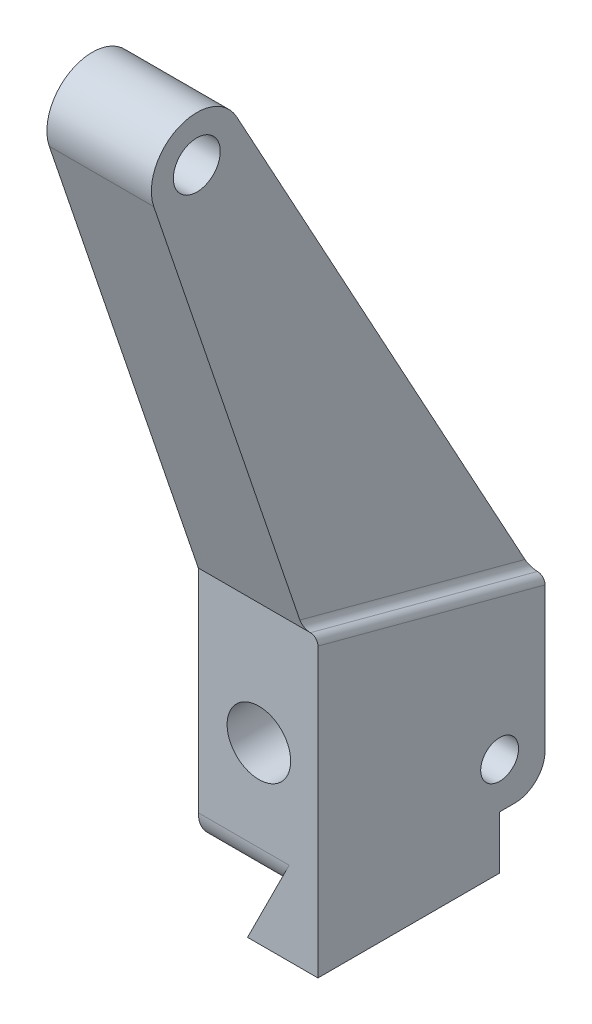
ISO-10303-21;
HEADER;
FILE_DESCRIPTION(('STEP AP214'),'2;1');
FILE_NAME('part.step','',(''),(''),'','','');
FILE_SCHEMA(('AUTOMOTIVE_DESIGN { 1 0 10303 214 1 1 1 1 }'));
ENDSEC;
DATA;
#1=APPLICATION_CONTEXT('core data for automotive mechanical design processes');
#2=APPLICATION_PROTOCOL_DEFINITION('international standard','automotive_design',2000,#1);
#3=PRODUCT_CONTEXT('',#1,'mechanical');
#4=PRODUCT('Part','Part','',(#3));
#5=PRODUCT_RELATED_PRODUCT_CATEGORY('part','',(#4));
#6=PRODUCT_DEFINITION_FORMATION('','',#4);
#7=PRODUCT_DEFINITION_CONTEXT('part definition',#1,'design');
#8=PRODUCT_DEFINITION('design','',#6,#7);
#9=PRODUCT_DEFINITION_SHAPE('','',#8);
#10=(LENGTH_UNIT() NAMED_UNIT(*) SI_UNIT(.MILLI.,.METRE.));
#11=(NAMED_UNIT(*) PLANE_ANGLE_UNIT() SI_UNIT($,.RADIAN.));
#12=(NAMED_UNIT(*) SI_UNIT($,.STERADIAN.) SOLID_ANGLE_UNIT());
#13=UNCERTAINTY_MEASURE_WITH_UNIT(LENGTH_MEASURE(1.E-05),#10,'distance_accuracy_value','');
#14=(GEOMETRIC_REPRESENTATION_CONTEXT(3) GLOBAL_UNCERTAINTY_ASSIGNED_CONTEXT((#13)) GLOBAL_UNIT_ASSIGNED_CONTEXT((#10,
#11,#12)) REPRESENTATION_CONTEXT('',''));
#15=CARTESIAN_POINT('',(0.,0.,0.));
#16=DIRECTION('',(0.,0.,1.));
#17=DIRECTION('',(1.,0.,0.));
#18=AXIS2_PLACEMENT_3D('',#15,#16,#17);
#19=CARTESIAN_POINT('',(8.,0.,0.));
#20=DIRECTION('',(0.,0.,1.));
#21=DIRECTION('',(1.,0.,0.));
#22=AXIS2_PLACEMENT_3D('',#19,#20,#21);
#23=PLANE('',#22);
#24=CARTESIAN_POINT('',(-4.,12.,0.));
#25=DIRECTION('',(0.,0.,-1.));
#26=DIRECTION('',(-1.,0.,0.));
#27=AXIS2_PLACEMENT_3D('',#24,#25,#26);
#28=CIRCLE('',#27,2.1);
#29=CARTESIAN_POINT('',(-6.1,12.,0.));
#30=VERTEX_POINT('',#29);
#31=EDGE_CURVE('E221',#30,#30,#28,.T.);
#32=ORIENTED_EDGE('',*,*,#31,.F.);
#33=EDGE_LOOP('',(#32));
#34=FACE_BOUND('',#33,.T.);
#35=DIRECTION('',(0.,1.,0.));
#36=VECTOR('',#35,1.);
#37=CARTESIAN_POINT('',(-0.0999999999999994,0.5,0.));
#38=LINE('',#37,#36);
#39=CARTESIAN_POINT('',(-0.0999999999999994,6.,0.));
#40=VERTEX_POINT('',#39);
#41=CARTESIAN_POINT('',(-0.0999999999999994,15.4825275101247,0.));
#42=VERTEX_POINT('',#41);
#43=EDGE_CURVE('E256',#40,#42,#38,.T.);
#44=ORIENTED_EDGE('',*,*,#43,.F.);
#45=DIRECTION('',(-1.,0.,0.));
#46=VECTOR('',#45,1.);
#47=CARTESIAN_POINT('',(-8.,6.,0.));
#48=LINE('',#47,#46);
#49=CARTESIAN_POINT('',(-8.,6.,0.));
#50=VERTEX_POINT('',#49);
#51=EDGE_CURVE('E182',#40,#50,#48,.T.);
#52=ORIENTED_EDGE('',*,*,#51,.T.);
#53=DIRECTION('',(0.,1.,0.));
#54=VECTOR('',#53,1.);
#55=CARTESIAN_POINT('',(-8.,0.,0.));
#56=LINE('',#55,#54);
#57=CARTESIAN_POINT('',(-8.,16.,0.));
#58=VERTEX_POINT('',#57);
#59=EDGE_CURVE('E235',#50,#58,#56,.T.);
#60=ORIENTED_EDGE('',*,*,#59,.T.);
#61=DIRECTION('',(-1.,0.,0.));
#62=VECTOR('',#61,1.);
#63=CARTESIAN_POINT('',(8.,16.,0.));
#64=LINE('',#63,#62);
#65=CARTESIAN_POINT('',(-0.6,16.,0.));
#66=VERTEX_POINT('',#65);
#67=EDGE_CURVE('E152',#66,#58,#64,.T.);
#68=ORIENTED_EDGE('',*,*,#67,.F.);
#69=CARTESIAN_POINT('',(-0.599999999999999,15.4825275101247,0.));
#70=DIRECTION('',(0.,0.,1.));
#71=DIRECTION('',(0.,1.,0.));
#72=AXIS2_PLACEMENT_3D('',#69,#70,#71);
#73=ELLIPSE('',#72,0.517472489875334,0.5);
#74=EDGE_CURVE('E164',#66,#42,#73,.F.);
#75=ORIENTED_EDGE('',*,*,#74,.T.);
#76=EDGE_LOOP('',(#44,#52,#60,#68,#75));
#77=FACE_BOUND('',#76,.T.);
#78=ADVANCED_FACE('F33',(#34,#77),#23,.F.);
#79=CARTESIAN_POINT('',(8.,20.,15.));
#80=DIRECTION('',(0.,0.,-1.));
#81=DIRECTION('',(0.,1.,0.));
#82=AXIS2_PLACEMENT_3D('',#79,#80,#81);
#83=PLANE('',#82);
#84=CARTESIAN_POINT('',(-4.,12.,15.));
#85=DIRECTION('',(0.,0.,-1.));
#86=DIRECTION('',(-1.,0.,0.));
#87=AXIS2_PLACEMENT_3D('',#84,#85,#86);
#88=CIRCLE('',#87,2.1);
#89=CARTESIAN_POINT('',(-6.1,12.,15.));
#90=VERTEX_POINT('',#89);
#91=EDGE_CURVE('E263',#90,#90,#88,.T.);
#92=ORIENTED_EDGE('',*,*,#91,.T.);
#93=EDGE_LOOP('',(#92));
#94=FACE_BOUND('',#93,.T.);
#95=DIRECTION('',(0.,-1.,0.));
#96=VECTOR('',#95,1.);
#97=CARTESIAN_POINT('',(-8.,20.,15.));
#98=LINE('',#97,#96);
#99=CARTESIAN_POINT('',(-8.,20.,15.));
#100=VERTEX_POINT('',#99);
#101=CARTESIAN_POINT('',(-8.,6.,15.));
#102=VERTEX_POINT('',#101);
#103=EDGE_CURVE('E203',#100,#102,#98,.T.);
#104=ORIENTED_EDGE('',*,*,#103,.T.);
#105=DIRECTION('',(-1.,0.,0.));
#106=VECTOR('',#105,1.);
#107=CARTESIAN_POINT('',(-3.,6.,15.));
#108=LINE('',#107,#106);
#109=CARTESIAN_POINT('',(-2.,5.99999999999999,15.));
#110=VERTEX_POINT('',#109);
#111=EDGE_CURVE('E41',#102,#110,#108,.F.);
#112=ORIENTED_EDGE('',*,*,#111,.T.);
#113=DIRECTION('',(0.447213595499958,0.894427190999916,0.));
#114=VECTOR('',#113,1.);
#115=CARTESIAN_POINT('',(5.6,21.2,15.));
#116=LINE('',#115,#114);
#117=CARTESIAN_POINT('',(-4.75000000000001,0.49999999999999,15.));
#118=VERTEX_POINT('',#117);
#119=EDGE_CURVE('E47',#118,#110,#116,.T.);
#120=ORIENTED_EDGE('',*,*,#119,.F.);
#121=DIRECTION('',(1.,0.,0.));
#122=VECTOR('',#121,1.);
#123=CARTESIAN_POINT('',(8.,0.5,15.));
#124=LINE('',#123,#122);
#125=CARTESIAN_POINT('',(-0.0999999999999994,0.500000000000001,15.));
#126=VERTEX_POINT('',#125);
#127=EDGE_CURVE('E237',#118,#126,#124,.T.);
#128=ORIENTED_EDGE('',*,*,#127,.T.);
#129=DIRECTION('',(0.,-1.,0.));
#130=VECTOR('',#129,1.);
#131=CARTESIAN_POINT('',(-0.0999999999999994,20.,15.));
#132=LINE('',#131,#130);
#133=CARTESIAN_POINT('',(-0.0999999999999994,19.4825275101247,15.));
#134=VERTEX_POINT('',#133);
#135=EDGE_CURVE('E261',#134,#126,#132,.T.);
#136=ORIENTED_EDGE('',*,*,#135,.F.);
#137=CARTESIAN_POINT('',(-0.599999999999999,19.4825275101247,15.));
#138=DIRECTION('',(0.,0.,-1.));
#139=DIRECTION('',(0.,1.,0.));
#140=AXIS2_PLACEMENT_3D('',#137,#138,#139);
#141=ELLIPSE('',#140,0.517472489875334,0.5);
#142=CARTESIAN_POINT('',(-0.6,20.,15.));
#143=VERTEX_POINT('',#142);
#144=EDGE_CURVE('E174',#134,#143,#141,.F.);
#145=ORIENTED_EDGE('',*,*,#144,.T.);
#146=DIRECTION('',(-1.,0.,0.));
#147=VECTOR('',#146,1.);
#148=CARTESIAN_POINT('',(8.,20.,15.));
#149=LINE('',#148,#147);
#150=EDGE_CURVE('E156',#143,#100,#149,.T.);
#151=ORIENTED_EDGE('',*,*,#150,.T.);
#152=EDGE_LOOP('',(#104,#112,#120,#128,#136,#145,#151));
#153=FACE_BOUND('',#152,.T.);
#154=ADVANCED_FACE('F200',(#94,#153),#83,.F.);
#155=CARTESIAN_POINT('',(8.,16.,0.));
#156=DIRECTION('',(0.,-0.479563476998526,0.877507191724994));
#157=DIRECTION('',(0.,-0.877507191724994,-0.479563476998526));
#158=AXIS2_PLACEMENT_3D('',#155,#156,#157);
#159=PLANE('',#158);
#160=DIRECTION('',(-1.,0.,0.));
#161=VECTOR('',#160,1.);
#162=CARTESIAN_POINT('',(8.,51.4386904309956,19.367478424825));
#163=LINE('',#162,#161);
#164=CARTESIAN_POINT('',(-1.1,51.4386904309956,19.367478424825));
#165=VERTEX_POINT('',#164);
#166=CARTESIAN_POINT('',(-8.,51.4386904309956,19.367478424825));
#167=VERTEX_POINT('',#166);
#168=EDGE_CURVE('E142',#165,#167,#163,.T.);
#169=ORIENTED_EDGE('',*,*,#168,.F.);
#170=DIRECTION('',(0.,0.877507191724994,0.479563476998525));
#171=VECTOR('',#170,1.);
#172=CARTESIAN_POINT('',(-1.1,51.4386904309956,19.367478424825));
#173=LINE('',#172,#171);
#174=CARTESIAN_POINT('',(-1.1,16.6057517835385,0.331047351236756));
#175=VERTEX_POINT('',#174);
#176=EDGE_CURVE('E124',#175,#165,#173,.T.);
#177=ORIENTED_EDGE('',*,*,#176,.F.);
#178=CARTESIAN_POINT('',(-0.599999999999999,16.6057517835385,0.331047351236756));
#179=DIRECTION('',(0.,-0.479563476998526,0.877507191724994));
#180=DIRECTION('',(0.,0.877507191724994,0.479563476998526));
#181=AXIS2_PLACEMENT_3D('',#178,#179,#180);
#182=ELLIPSE('',#181,0.690309765265502,0.5);
#183=EDGE_CURVE('E178',#175,#66,#182,.T.);
#184=ORIENTED_EDGE('',*,*,#183,.T.);
#185=ORIENTED_EDGE('',*,*,#67,.T.);
#186=DIRECTION('',(0.,0.877507191724994,0.479563476998526));
#187=VECTOR('',#186,1.);
#188=CARTESIAN_POINT('',(-8.,16.,0.));
#189=LINE('',#188,#187);
#190=EDGE_CURVE('E151',#58,#167,#189,.T.);
#191=ORIENTED_EDGE('',*,*,#190,.T.);
#192=EDGE_LOOP('',(#169,#177,#184,#185,#191));
#193=FACE_BOUND('',#192,.T.);
#194=ADVANCED_FACE('F148',(#193),#159,.F.);
#195=CARTESIAN_POINT('',(8.,50.,22.));
#196=DIRECTION('',(-1.,0.,0.));
#197=DIRECTION('',(0.,0.,1.));
#198=AXIS2_PLACEMENT_3D('',#195,#196,#197);
#199=CYLINDRICAL_SURFACE('',#198,3.);
#200=DIRECTION('',(-1.,0.,0.));
#201=VECTOR('',#200,1.);
#202=CARTESIAN_POINT('',(8.,49.0370412980993,24.8412515795744));
#203=LINE('',#202,#201);
#204=CARTESIAN_POINT('',(-1.1,49.0370412980993,24.8412515795744));
#205=VERTEX_POINT('',#204);
#206=CARTESIAN_POINT('',(-8.,49.0370412980993,24.8412515795744));
#207=VERTEX_POINT('',#206);
#208=EDGE_CURVE('E144',#205,#207,#203,.T.);
#209=ORIENTED_EDGE('',*,*,#208,.F.);
#210=CARTESIAN_POINT('',(-1.1,50.,22.));
#211=DIRECTION('',(1.,0.,0.));
#212=DIRECTION('',(0.,0.,1.));
#213=AXIS2_PLACEMENT_3D('',#210,#211,#212);
#214=CIRCLE('',#213,3.);
#215=EDGE_CURVE('E128',#165,#205,#214,.T.);
#216=ORIENTED_EDGE('',*,*,#215,.F.);
#217=ORIENTED_EDGE('',*,*,#168,.T.);
#218=CARTESIAN_POINT('',(-8.,50.,22.));
#219=DIRECTION('',(1.,0.,0.));
#220=DIRECTION('',(0.,0.,-1.));
#221=AXIS2_PLACEMENT_3D('',#218,#219,#220);
#222=CIRCLE('',#221,3.);
#223=EDGE_CURVE('E232',#167,#207,#222,.T.);
#224=ORIENTED_EDGE('',*,*,#223,.T.);
#225=EDGE_LOOP('',(#209,#216,#217,#224));
#226=FACE_BOUND('',#225,.T.);
#227=ADVANCED_FACE('F140',(#226),#199,.T.);
#228=CARTESIAN_POINT('',(8.,20.,15.));
#229=DIRECTION('',(0.,0.320986233966894,-0.947083859858117));
#230=DIRECTION('',(0.,0.947083859858118,0.320986233966894));
#231=AXIS2_PLACEMENT_3D('',#228,#229,#230);
#232=PLANE('',#231);
#233=ORIENTED_EDGE('',*,*,#150,.F.);
#234=CARTESIAN_POINT('',(-0.599999999999999,20.5688879125462,15.1928078350156));
#235=DIRECTION('',(0.,0.320986233966894,-0.947083859858117));
#236=DIRECTION('',(0.,0.947083859858118,0.320986233966894));
#237=AXIS2_PLACEMENT_3D('',#234,#235,#236);
#238=ELLIPSE('',#237,0.600673220881825,0.5);
#239=CARTESIAN_POINT('',(-1.1,20.5688879125462,15.1928078350156));
#240=VERTEX_POINT('',#239);
#241=EDGE_CURVE('E180',#143,#240,#238,.T.);
#242=ORIENTED_EDGE('',*,*,#241,.T.);
#243=DIRECTION('',(0.,-0.947083859858117,-0.320986233966894));
#244=VECTOR('',#243,1.);
#245=CARTESIAN_POINT('',(-1.1,20.,15.));
#246=LINE('',#245,#244);
#247=EDGE_CURVE('E145',#205,#240,#246,.T.);
#248=ORIENTED_EDGE('',*,*,#247,.F.);
#249=ORIENTED_EDGE('',*,*,#208,.T.);
#250=DIRECTION('',(0.,-0.947083859858117,-0.320986233966894));
#251=VECTOR('',#250,1.);
#252=CARTESIAN_POINT('',(-8.,20.,15.));
#253=LINE('',#252,#251);
#254=EDGE_CURVE('E229',#207,#100,#253,.T.);
#255=ORIENTED_EDGE('',*,*,#254,.T.);
#256=EDGE_LOOP('',(#233,#242,#248,#249,#255));
#257=FACE_BOUND('',#256,.T.);
#258=ADVANCED_FACE('F242',(#257),#232,.F.);
#259=CARTESIAN_POINT('',(8.,50.,22.));
#260=DIRECTION('',(-1.,0.,0.));
#261=DIRECTION('',(0.,0.,1.));
#262=AXIS2_PLACEMENT_3D('',#259,#260,#261);
#263=CYLINDRICAL_SURFACE('',#262,1.55);
#264=CARTESIAN_POINT('',(-1.1,50.,22.));
#265=DIRECTION('',(-1.,0.,0.));
#266=DIRECTION('',(0.,0.,1.));
#267=AXIS2_PLACEMENT_3D('',#264,#265,#266);
#268=CIRCLE('',#267,1.55);
#269=CARTESIAN_POINT('',(-1.1,50.,23.55));
#270=VERTEX_POINT('',#269);
#271=EDGE_CURVE('E165',#270,#270,#268,.T.);
#272=ORIENTED_EDGE('',*,*,#271,.F.);
#273=EDGE_LOOP('',(#272));
#274=FACE_BOUND('',#273,.T.);
#275=CARTESIAN_POINT('',(-8.,50.,22.));
#276=DIRECTION('',(1.,0.,0.));
#277=DIRECTION('',(0.,0.,-1.));
#278=AXIS2_PLACEMENT_3D('',#275,#276,#277);
#279=CIRCLE('',#278,1.55);
#280=CARTESIAN_POINT('',(-8.,50.,20.45));
#281=VERTEX_POINT('',#280);
#282=EDGE_CURVE('E225',#281,#281,#279,.T.);
#283=ORIENTED_EDGE('',*,*,#282,.F.);
#284=EDGE_LOOP('',(#283));
#285=FACE_BOUND('',#284,.T.);
#286=ADVANCED_FACE('F338',(#274,#285),#263,.F.);
#287=CARTESIAN_POINT('',(8.,7.,3.));
#288=DIRECTION('',(1.,0.,0.));
#289=DIRECTION('',(0.,0.,-1.));
#290=AXIS2_PLACEMENT_3D('',#287,#288,#289);
#291=CYLINDRICAL_SURFACE('',#290,1.24999999999999);
#292=CARTESIAN_POINT('',(-8.,7.,3.));
#293=DIRECTION('',(-1.,0.,0.));
#294=DIRECTION('',(0.,0.,1.));
#295=AXIS2_PLACEMENT_3D('',#292,#293,#294);
#296=CIRCLE('',#295,1.24999999999999);
#297=CARTESIAN_POINT('',(-8.,7.,4.24999999999999));
#298=VERTEX_POINT('',#297);
#299=EDGE_CURVE('E217',#298,#298,#296,.T.);
#300=ORIENTED_EDGE('',*,*,#299,.T.);
#301=EDGE_LOOP('',(#300));
#302=FACE_BOUND('',#301,.T.);
#303=CARTESIAN_POINT('',(-0.0999999999999994,7.,3.));
#304=DIRECTION('',(1.,0.,0.));
#305=DIRECTION('',(0.,0.,-1.));
#306=AXIS2_PLACEMENT_3D('',#303,#304,#305);
#307=CIRCLE('',#306,1.24999999999999);
#308=CARTESIAN_POINT('',(-0.0999999999999994,7.,1.75000000000001));
#309=VERTEX_POINT('',#308);
#310=EDGE_CURVE('E258',#309,#309,#307,.F.);
#311=ORIENTED_EDGE('',*,*,#310,.F.);
#312=EDGE_LOOP('',(#311));
#313=FACE_BOUND('',#312,.T.);
#314=ADVANCED_FACE('F333',(#302,#313),#291,.F.);
#315=CARTESIAN_POINT('',(0.,0.5,25.));
#316=DIRECTION('',(0.,1.,0.));
#317=DIRECTION('',(-1.,0.,0.));
#318=AXIS2_PLACEMENT_3D('',#315,#316,#317);
#319=PLANE('',#318);
#320=DIRECTION('',(0.,0.,1.));
#321=VECTOR('',#320,1.);
#322=CARTESIAN_POINT('',(-4.75,0.499999999999999,25.));
#323=LINE('',#322,#321);
#324=CARTESIAN_POINT('',(-4.75,0.5,3.));
#325=VERTEX_POINT('',#324);
#326=EDGE_CURVE('E154',#325,#118,#323,.T.);
#327=ORIENTED_EDGE('',*,*,#326,.F.);
#328=DIRECTION('',(-1.,0.,0.));
#329=VECTOR('',#328,1.);
#330=CARTESIAN_POINT('',(-0.0999999999999994,0.5,3.));
#331=LINE('',#330,#329);
#332=CARTESIAN_POINT('',(-0.0999999999999994,0.5,3.));
#333=VERTEX_POINT('',#332);
#334=EDGE_CURVE('E168',#333,#325,#331,.T.);
#335=ORIENTED_EDGE('',*,*,#334,.F.);
#336=DIRECTION('',(0.,0.,-1.));
#337=VECTOR('',#336,1.);
#338=CARTESIAN_POINT('',(-0.0999999999999994,0.5,25.));
#339=LINE('',#338,#337);
#340=EDGE_CURVE('E161',#126,#333,#339,.T.);
#341=ORIENTED_EDGE('',*,*,#340,.F.);
#342=ORIENTED_EDGE('',*,*,#127,.F.);
#343=EDGE_LOOP('',(#327,#335,#341,#342));
#344=FACE_BOUND('',#343,.T.);
#345=ADVANCED_FACE('F321',(#344),#319,.F.);
#346=CARTESIAN_POINT('',(-5.,0.,25.));
#347=DIRECTION('',(-0.894427190999916,0.447213595499958,0.));
#348=DIRECTION('',(-0.447213595499958,-0.894427190999916,0.));
#349=AXIS2_PLACEMENT_3D('',#346,#347,#348);
#350=PLANE('',#349);
#351=DIRECTION('',(0.447213595499957,0.894427190999916,0.));
#352=VECTOR('',#351,1.);
#353=CARTESIAN_POINT('',(-4.75,0.5,3.));
#354=LINE('',#353,#352);
#355=CARTESIAN_POINT('',(-3.,4.,3.));
#356=VERTEX_POINT('',#355);
#357=EDGE_CURVE('E246',#325,#356,#354,.T.);
#358=ORIENTED_EDGE('',*,*,#357,.F.);
#359=ORIENTED_EDGE('',*,*,#326,.T.);
#360=ORIENTED_EDGE('',*,*,#119,.T.);
#361=CARTESIAN_POINT('',(-2.,6.,13.));
#362=DIRECTION('',(-0.894427190999916,0.447213595499958,0.));
#363=DIRECTION('',(0.447213595499958,0.894427190999916,0.));
#364=AXIS2_PLACEMENT_3D('',#361,#362,#363);
#365=ELLIPSE('',#364,2.23606797749979,2.);
#366=CARTESIAN_POINT('',(-3.,4.,13.));
#367=VERTEX_POINT('',#366);
#368=EDGE_CURVE('E11',#110,#367,#365,.F.);
#369=ORIENTED_EDGE('',*,*,#368,.T.);
#370=DIRECTION('',(0.,0.,-1.));
#371=VECTOR('',#370,1.);
#372=CARTESIAN_POINT('',(-3.,4.,25.));
#373=LINE('',#372,#371);
#374=EDGE_CURVE('E213',#367,#356,#373,.T.);
#375=ORIENTED_EDGE('',*,*,#374,.T.);
#376=EDGE_LOOP('',(#358,#359,#360,#369,#375));
#377=FACE_BOUND('',#376,.T.);
#378=ADVANCED_FACE('F325',(#377),#350,.T.);
#379=CARTESIAN_POINT('',(-8.,50.,22.));
#380=DIRECTION('',(-1.,0.,0.));
#381=DIRECTION('',(0.,0.,-1.));
#382=AXIS2_PLACEMENT_3D('',#379,#380,#381);
#383=PLANE('',#382);
#384=ORIENTED_EDGE('',*,*,#299,.F.);
#385=EDGE_LOOP('',(#384));
#386=FACE_BOUND('',#385,.T.);
#387=ORIENTED_EDGE('',*,*,#282,.T.);
#388=EDGE_LOOP('',(#387));
#389=FACE_BOUND('',#388,.T.);
#390=ORIENTED_EDGE('',*,*,#59,.F.);
#391=CARTESIAN_POINT('',(-8.,6.,2.));
#392=DIRECTION('',(-1.,0.,0.));
#393=DIRECTION('',(0.,0.,1.));
#394=AXIS2_PLACEMENT_3D('',#391,#392,#393);
#395=CIRCLE('',#394,2.);
#396=CARTESIAN_POINT('',(-8.,4.,2.));
#397=VERTEX_POINT('',#396);
#398=EDGE_CURVE('E189',#50,#397,#395,.T.);
#399=ORIENTED_EDGE('',*,*,#398,.T.);
#400=DIRECTION('',(0.,0.,-1.));
#401=VECTOR('',#400,1.);
#402=CARTESIAN_POINT('',(-8.,4.,25.));
#403=LINE('',#402,#401);
#404=CARTESIAN_POINT('',(-8.,4.,13.));
#405=VERTEX_POINT('',#404);
#406=EDGE_CURVE('E210',#405,#397,#403,.T.);
#407=ORIENTED_EDGE('',*,*,#406,.F.);
#408=CARTESIAN_POINT('',(-8.,6.,13.));
#409=DIRECTION('',(-1.,0.,0.));
#410=DIRECTION('',(0.,0.,1.));
#411=AXIS2_PLACEMENT_3D('',#408,#409,#410);
#412=CIRCLE('',#411,2.);
#413=EDGE_CURVE('E187',#405,#102,#412,.T.);
#414=ORIENTED_EDGE('',*,*,#413,.T.);
#415=ORIENTED_EDGE('',*,*,#103,.F.);
#416=ORIENTED_EDGE('',*,*,#254,.F.);
#417=ORIENTED_EDGE('',*,*,#223,.F.);
#418=ORIENTED_EDGE('',*,*,#190,.F.);
#419=EDGE_LOOP('',(#390,#399,#407,#414,#415,#416,#417,#418));
#420=FACE_BOUND('',#419,.T.);
#421=ADVANCED_FACE('F216',(#386,#389,#420),#383,.T.);
#422=CARTESIAN_POINT('',(-3.,4.,25.));
#423=DIRECTION('',(0.,-1.,0.));
#424=DIRECTION('',(0.,0.,-1.));
#425=AXIS2_PLACEMENT_3D('',#422,#423,#424);
#426=PLANE('',#425);
#427=ORIENTED_EDGE('',*,*,#406,.T.);
#428=DIRECTION('',(-1.,0.,0.));
#429=VECTOR('',#428,1.);
#430=CARTESIAN_POINT('',(-0.0999999999999994,4.,2.));
#431=LINE('',#430,#429);
#432=CARTESIAN_POINT('',(-0.0999999999999994,4.,2.));
#433=VERTEX_POINT('',#432);
#434=EDGE_CURVE('E194',#397,#433,#431,.F.);
#435=ORIENTED_EDGE('',*,*,#434,.T.);
#436=DIRECTION('',(0.,0.,-1.));
#437=VECTOR('',#436,1.);
#438=CARTESIAN_POINT('',(-0.0999999999999994,4.,3.));
#439=LINE('',#438,#437);
#440=CARTESIAN_POINT('',(-0.0999999999999994,4.,3.));
#441=VERTEX_POINT('',#440);
#442=EDGE_CURVE('E253',#441,#433,#439,.T.);
#443=ORIENTED_EDGE('',*,*,#442,.F.);
#444=DIRECTION('',(1.,0.,0.));
#445=VECTOR('',#444,1.);
#446=CARTESIAN_POINT('',(-3.,4.,3.));
#447=LINE('',#446,#445);
#448=EDGE_CURVE('E249',#356,#441,#447,.T.);
#449=ORIENTED_EDGE('',*,*,#448,.F.);
#450=ORIENTED_EDGE('',*,*,#374,.F.);
#451=DIRECTION('',(-1.,0.,0.));
#452=VECTOR('',#451,1.);
#453=CARTESIAN_POINT('',(-8.,4.,13.));
#454=LINE('',#453,#452);
#455=EDGE_CURVE('E191',#367,#405,#454,.T.);
#456=ORIENTED_EDGE('',*,*,#455,.T.);
#457=EDGE_LOOP('',(#427,#435,#443,#449,#450,#456));
#458=FACE_BOUND('',#457,.T.);
#459=ADVANCED_FACE('F209',(#458),#426,.T.);
#460=CARTESIAN_POINT('',(-4.,12.,0.));
#461=DIRECTION('',(0.,0.,1.));
#462=DIRECTION('',(1.,0.,0.));
#463=AXIS2_PLACEMENT_3D('',#460,#461,#462);
#464=CYLINDRICAL_SURFACE('',#463,2.1);
#465=ORIENTED_EDGE('',*,*,#31,.T.);
#466=EDGE_LOOP('',(#465));
#467=FACE_BOUND('',#466,.T.);
#468=ORIENTED_EDGE('',*,*,#91,.F.);
#469=EDGE_LOOP('',(#468));
#470=FACE_BOUND('',#469,.T.);
#471=ADVANCED_FACE('F270',(#467,#470),#464,.F.);
#472=CARTESIAN_POINT('',(-0.0999999999999994,0.,0.));
#473=DIRECTION('',(1.,0.,0.));
#474=DIRECTION('',(0.,0.,-1.));
#475=AXIS2_PLACEMENT_3D('',#472,#473,#474);
#476=PLANE('',#475);
#477=ORIENTED_EDGE('',*,*,#442,.T.);
#478=CARTESIAN_POINT('',(-0.0999999999999994,6.,2.));
#479=DIRECTION('',(1.,0.,0.));
#480=DIRECTION('',(0.,0.,-1.));
#481=AXIS2_PLACEMENT_3D('',#478,#479,#480);
#482=CIRCLE('',#481,2.);
#483=EDGE_CURVE('E196',#433,#40,#482,.T.);
#484=ORIENTED_EDGE('',*,*,#483,.T.);
#485=ORIENTED_EDGE('',*,*,#43,.T.);
#486=DIRECTION('',(0.,-0.257662650560333,-0.966234939601246));
#487=VECTOR('',#486,1.);
#488=CARTESIAN_POINT('',(-0.0999999999999994,19.5168825301994,15.1288313252802));
#489=LINE('',#488,#487);
#490=EDGE_CURVE('E171',#42,#134,#489,.F.);
#491=ORIENTED_EDGE('',*,*,#490,.T.);
#492=ORIENTED_EDGE('',*,*,#135,.T.);
#493=ORIENTED_EDGE('',*,*,#340,.T.);
#494=DIRECTION('',(0.,-1.,0.));
#495=VECTOR('',#494,1.);
#496=CARTESIAN_POINT('',(-0.0999999999999994,4.,3.));
#497=LINE('',#496,#495);
#498=EDGE_CURVE('E251',#441,#333,#497,.T.);
#499=ORIENTED_EDGE('',*,*,#498,.F.);
#500=EDGE_LOOP('',(#477,#484,#485,#491,#492,#493,#499));
#501=FACE_BOUND('',#500,.T.);
#502=ORIENTED_EDGE('',*,*,#310,.T.);
#503=EDGE_LOOP('',(#502));
#504=FACE_BOUND('',#503,.T.);
#505=ADVANCED_FACE('F272',(#501,#504),#476,.T.);
#506=CARTESIAN_POINT('',(0.,0.,3.));
#507=DIRECTION('',(0.,0.,1.));
#508=DIRECTION('',(1.,0.,0.));
#509=AXIS2_PLACEMENT_3D('',#506,#507,#508);
#510=PLANE('',#509);
#511=ORIENTED_EDGE('',*,*,#334,.T.);
#512=ORIENTED_EDGE('',*,*,#357,.T.);
#513=ORIENTED_EDGE('',*,*,#448,.T.);
#514=ORIENTED_EDGE('',*,*,#498,.T.);
#515=EDGE_LOOP('',(#511,#512,#513,#514));
#516=FACE_BOUND('',#515,.T.);
#517=ADVANCED_FACE('F279',(#516),#510,.F.);
#518=CARTESIAN_POINT('',(-1.1,50.,22.));
#519=DIRECTION('',(-1.,0.,0.));
#520=DIRECTION('',(0.,0.,1.));
#521=AXIS2_PLACEMENT_3D('',#518,#519,#520);
#522=PLANE('',#521);
#523=ORIENTED_EDGE('',*,*,#271,.T.);
#524=EDGE_LOOP('',(#523));
#525=FACE_BOUND('',#524,.T.);
#526=ORIENTED_EDGE('',*,*,#247,.T.);
#527=DIRECTION('',(0.,-0.257662650560333,-0.966234939601246));
#528=VECTOR('',#527,1.);
#529=CARTESIAN_POINT('',(-1.1,16.4831174698006,-0.128831325280184));
#530=LINE('',#529,#528);
#531=EDGE_CURVE('E131',#240,#175,#530,.T.);
#532=ORIENTED_EDGE('',*,*,#531,.T.);
#533=ORIENTED_EDGE('',*,*,#176,.T.);
#534=ORIENTED_EDGE('',*,*,#215,.T.);
#535=EDGE_LOOP('',(#526,#532,#533,#534));
#536=FACE_BOUND('',#535,.T.);
#537=ADVANCED_FACE('F127',(#525,#536),#522,.F.);
#538=CARTESIAN_POINT('',(-0.599999999999999,24.2175573038255,28.8753180523132));
#539=DIRECTION('',(0.,0.257662650560333,0.966234939601246));
#540=DIRECTION('',(0.,-0.966234939601246,0.257662650560333));
#541=AXIS2_PLACEMENT_3D('',#538,#539,#540);
#542=CYLINDRICAL_SURFACE('',#541,0.5);
#543=ORIENTED_EDGE('',*,*,#531,.F.);
#544=ORIENTED_EDGE('',*,*,#241,.F.);
#545=DIRECTION('',(0.,-0.257662650560333,-0.966234939601246));
#546=VECTOR('',#545,1.);
#547=CARTESIAN_POINT('',(-0.599999999999999,20.,15.));
#548=LINE('',#547,#546);
#549=EDGE_CURVE('E136',#66,#143,#548,.F.);
#550=ORIENTED_EDGE('',*,*,#549,.F.);
#551=ORIENTED_EDGE('',*,*,#183,.F.);
#552=EDGE_LOOP('',(#543,#544,#550,#551));
#553=FACE_BOUND('',#552,.T.);
#554=ADVANCED_FACE('F300',(#553),#542,.F.);
#555=CARTESIAN_POINT('',(-0.599999999999999,15.5168825301994,0.128831325280162));
#556=DIRECTION('',(0.,0.257662650560333,0.966234939601246));
#557=DIRECTION('',(0.,-0.966234939601246,0.257662650560333));
#558=AXIS2_PLACEMENT_3D('',#555,#556,#557);
#559=CYLINDRICAL_SURFACE('',#558,0.5);
#560=ORIENTED_EDGE('',*,*,#144,.F.);
#561=ORIENTED_EDGE('',*,*,#490,.F.);
#562=ORIENTED_EDGE('',*,*,#74,.F.);
#563=ORIENTED_EDGE('',*,*,#549,.T.);
#564=EDGE_LOOP('',(#560,#561,#562,#563));
#565=FACE_BOUND('',#564,.T.);
#566=ADVANCED_FACE('F296',(#565),#559,.T.);
#567=CARTESIAN_POINT('',(8.,6.,2.));
#568=DIRECTION('',(1.,0.,0.));
#569=DIRECTION('',(0.,0.,-1.));
#570=AXIS2_PLACEMENT_3D('',#567,#568,#569);
#571=CYLINDRICAL_SURFACE('',#570,2.);
#572=ORIENTED_EDGE('',*,*,#483,.F.);
#573=ORIENTED_EDGE('',*,*,#434,.F.);
#574=ORIENTED_EDGE('',*,*,#398,.F.);
#575=ORIENTED_EDGE('',*,*,#51,.F.);
#576=EDGE_LOOP('',(#572,#573,#574,#575));
#577=FACE_BOUND('',#576,.T.);
#578=ADVANCED_FACE('F299',(#577),#571,.T.);
#579=CARTESIAN_POINT('',(-3.,6.,13.));
#580=DIRECTION('',(1.,0.,0.));
#581=DIRECTION('',(0.,0.,-1.));
#582=AXIS2_PLACEMENT_3D('',#579,#580,#581);
#583=CYLINDRICAL_SURFACE('',#582,2.);
#584=ORIENTED_EDGE('',*,*,#368,.F.);
#585=ORIENTED_EDGE('',*,*,#111,.F.);
#586=ORIENTED_EDGE('',*,*,#413,.F.);
#587=ORIENTED_EDGE('',*,*,#455,.F.);
#588=EDGE_LOOP('',(#584,#585,#586,#587));
#589=FACE_BOUND('',#588,.T.);
#590=ADVANCED_FACE('F35',(#589),#583,.T.);
#591=CLOSED_SHELL('',(#78,#154,#194,#227,#258,#286,#314,#345,#378,#421,#459,#471,#505,#517,#537,
#554,#566,#578,#590));
#592=MANIFOLD_SOLID_BREP('B2',#591);
#593=ADVANCED_BREP_SHAPE_REPRESENTATION('',(#18,#592),#14);
#594=SHAPE_DEFINITION_REPRESENTATION(#9,#593);
ENDSEC;
END-ISO-10303-21;
